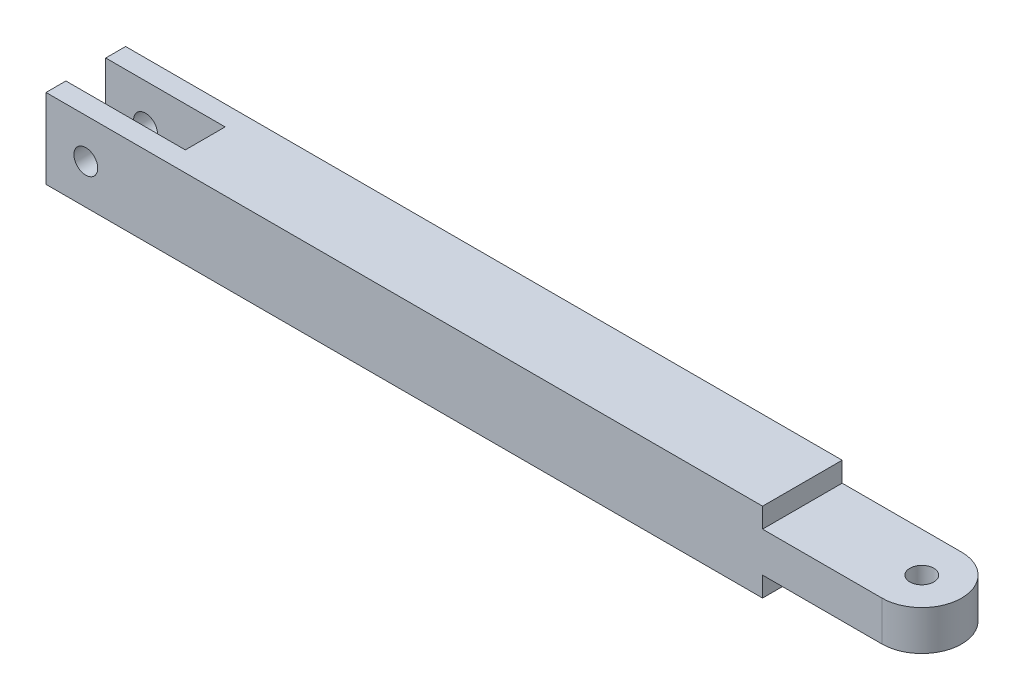
ISO-10303-21;
HEADER;
FILE_DESCRIPTION(('STEP AP214'),'2;1');
FILE_NAME('part.step','',(''),(''),'','','');
FILE_SCHEMA(('AUTOMOTIVE_DESIGN { 1 0 10303 214 1 1 1 1 }'));
ENDSEC;
DATA;
#1=APPLICATION_CONTEXT('core data for automotive mechanical design processes');
#2=APPLICATION_PROTOCOL_DEFINITION('international standard','automotive_design',2000,#1);
#3=PRODUCT_CONTEXT('',#1,'mechanical');
#4=PRODUCT('Part','Part','',(#3));
#5=PRODUCT_RELATED_PRODUCT_CATEGORY('part','',(#4));
#6=PRODUCT_DEFINITION_FORMATION('','',#4);
#7=PRODUCT_DEFINITION_CONTEXT('part definition',#1,'design');
#8=PRODUCT_DEFINITION('design','',#6,#7);
#9=PRODUCT_DEFINITION_SHAPE('','',#8);
#10=(LENGTH_UNIT() NAMED_UNIT(*) SI_UNIT(.MILLI.,.METRE.));
#11=(NAMED_UNIT(*) PLANE_ANGLE_UNIT() SI_UNIT($,.RADIAN.));
#12=(NAMED_UNIT(*) SI_UNIT($,.STERADIAN.) SOLID_ANGLE_UNIT());
#13=UNCERTAINTY_MEASURE_WITH_UNIT(LENGTH_MEASURE(1.E-05),#10,'distance_accuracy_value','');
#14=(GEOMETRIC_REPRESENTATION_CONTEXT(3) GLOBAL_UNCERTAINTY_ASSIGNED_CONTEXT((#13)) GLOBAL_UNIT_ASSIGNED_CONTEXT((#10,
#11,#12)) REPRESENTATION_CONTEXT('',''));
#15=CARTESIAN_POINT('',(0.,0.,0.));
#16=DIRECTION('',(0.,0.,1.));
#17=DIRECTION('',(1.,0.,0.));
#18=AXIS2_PLACEMENT_3D('',#15,#16,#17);
#19=CARTESIAN_POINT('',(0.,0.,0.));
#20=DIRECTION('',(0.,-1.,0.));
#21=DIRECTION('',(0.,0.,-1.));
#22=AXIS2_PLACEMENT_3D('',#19,#20,#21);
#23=PLANE('',#22);
#24=DIRECTION('',(-1.,0.,0.));
#25=VECTOR('',#24,1.);
#26=CARTESIAN_POINT('',(-50.,0.,-5.));
#27=LINE('',#26,#25);
#28=CARTESIAN_POINT('',(40.,0.,-5.));
#29=VERTEX_POINT('',#28);
#30=CARTESIAN_POINT('',(-50.,0.,-5.));
#31=VERTEX_POINT('',#30);
#32=EDGE_CURVE('E134',#29,#31,#27,.T.);
#33=ORIENTED_EDGE('',*,*,#32,.F.);
#34=DIRECTION('',(0.,0.,-1.));
#35=VECTOR('',#34,1.);
#36=CARTESIAN_POINT('',(40.,0.,5.));
#37=LINE('',#36,#35);
#38=CARTESIAN_POINT('',(40.,0.,5.));
#39=VERTEX_POINT('',#38);
#40=EDGE_CURVE('E194',#39,#29,#37,.T.);
#41=ORIENTED_EDGE('',*,*,#40,.F.);
#42=DIRECTION('',(1.,0.,0.));
#43=VECTOR('',#42,1.);
#44=CARTESIAN_POINT('',(-50.,0.,5.));
#45=LINE('',#44,#43);
#46=CARTESIAN_POINT('',(-50.,0.,5.));
#47=VERTEX_POINT('',#46);
#48=EDGE_CURVE('E145',#47,#39,#45,.T.);
#49=ORIENTED_EDGE('',*,*,#48,.F.);
#50=DIRECTION('',(0.,0.,1.));
#51=VECTOR('',#50,1.);
#52=CARTESIAN_POINT('',(-50.,0.,5.));
#53=LINE('',#52,#51);
#54=CARTESIAN_POINT('',(-50.,0.,2.5));
#55=VERTEX_POINT('',#54);
#56=EDGE_CURVE('E86',#55,#47,#53,.T.);
#57=ORIENTED_EDGE('',*,*,#56,.F.);
#58=DIRECTION('',(-1.,0.,0.));
#59=VECTOR('',#58,1.);
#60=CARTESIAN_POINT('',(-50.,0.,2.5));
#61=LINE('',#60,#59);
#62=CARTESIAN_POINT('',(-35.,0.,2.5));
#63=VERTEX_POINT('',#62);
#64=EDGE_CURVE('E142',#63,#55,#61,.T.);
#65=ORIENTED_EDGE('',*,*,#64,.F.);
#66=DIRECTION('',(0.,0.,1.));
#67=VECTOR('',#66,1.);
#68=CARTESIAN_POINT('',(-35.,0.,-2.5));
#69=LINE('',#68,#67);
#70=CARTESIAN_POINT('',(-35.,0.,-2.5));
#71=VERTEX_POINT('',#70);
#72=EDGE_CURVE('E120',#71,#63,#69,.T.);
#73=ORIENTED_EDGE('',*,*,#72,.F.);
#74=DIRECTION('',(1.,0.,0.));
#75=VECTOR('',#74,1.);
#76=CARTESIAN_POINT('',(-50.,0.,-2.5));
#77=LINE('',#76,#75);
#78=CARTESIAN_POINT('',(-50.,0.,-2.5));
#79=VERTEX_POINT('',#78);
#80=EDGE_CURVE('E139',#79,#71,#77,.T.);
#81=ORIENTED_EDGE('',*,*,#80,.F.);
#82=DIRECTION('',(0.,0.,1.));
#83=VECTOR('',#82,1.);
#84=CARTESIAN_POINT('',(-50.,0.,-2.5));
#85=LINE('',#84,#83);
#86=EDGE_CURVE('E136',#31,#79,#85,.T.);
#87=ORIENTED_EDGE('',*,*,#86,.F.);
#88=EDGE_LOOP('',(#33,#41,#49,#57,#65,#73,#81,#87));
#89=FACE_BOUND('',#88,.T.);
#90=ADVANCED_FACE('F33',(#89),#23,.T.);
#91=CARTESIAN_POINT('',(0.,10.,0.));
#92=DIRECTION('',(0.,-1.,0.));
#93=DIRECTION('',(0.,0.,-1.));
#94=AXIS2_PLACEMENT_3D('',#91,#92,#93);
#95=PLANE('',#94);
#96=DIRECTION('',(0.,0.,1.));
#97=VECTOR('',#96,1.);
#98=CARTESIAN_POINT('',(40.,10.,-5.));
#99=LINE('',#98,#97);
#100=CARTESIAN_POINT('',(40.,10.,-5.));
#101=VERTEX_POINT('',#100);
#102=CARTESIAN_POINT('',(40.,10.,5.));
#103=VERTEX_POINT('',#102);
#104=EDGE_CURVE('E208',#101,#103,#99,.T.);
#105=ORIENTED_EDGE('',*,*,#104,.F.);
#106=DIRECTION('',(-1.,0.,0.));
#107=VECTOR('',#106,1.);
#108=CARTESIAN_POINT('',(-50.,10.,-5.));
#109=LINE('',#108,#107);
#110=CARTESIAN_POINT('',(-50.,10.,-5.));
#111=VERTEX_POINT('',#110);
#112=EDGE_CURVE('E94',#101,#111,#109,.T.);
#113=ORIENTED_EDGE('',*,*,#112,.T.);
#114=DIRECTION('',(0.,0.,1.));
#115=VECTOR('',#114,1.);
#116=CARTESIAN_POINT('',(-50.,10.,-2.5));
#117=LINE('',#116,#115);
#118=CARTESIAN_POINT('',(-50.,10.,-2.5));
#119=VERTEX_POINT('',#118);
#120=EDGE_CURVE('E234',#111,#119,#117,.T.);
#121=ORIENTED_EDGE('',*,*,#120,.T.);
#122=DIRECTION('',(1.,0.,0.));
#123=VECTOR('',#122,1.);
#124=CARTESIAN_POINT('',(-50.,10.,-2.5));
#125=LINE('',#124,#123);
#126=CARTESIAN_POINT('',(-35.,10.,-2.5));
#127=VERTEX_POINT('',#126);
#128=EDGE_CURVE('E111',#119,#127,#125,.T.);
#129=ORIENTED_EDGE('',*,*,#128,.T.);
#130=DIRECTION('',(0.,0.,1.));
#131=VECTOR('',#130,1.);
#132=CARTESIAN_POINT('',(-35.,10.,-2.5));
#133=LINE('',#132,#131);
#134=CARTESIAN_POINT('',(-35.,10.,2.5));
#135=VERTEX_POINT('',#134);
#136=EDGE_CURVE('E104',#127,#135,#133,.T.);
#137=ORIENTED_EDGE('',*,*,#136,.T.);
#138=DIRECTION('',(-1.,0.,0.));
#139=VECTOR('',#138,1.);
#140=CARTESIAN_POINT('',(-50.,10.,2.5));
#141=LINE('',#140,#139);
#142=CARTESIAN_POINT('',(-50.,10.,2.5));
#143=VERTEX_POINT('',#142);
#144=EDGE_CURVE('E108',#135,#143,#141,.T.);
#145=ORIENTED_EDGE('',*,*,#144,.T.);
#146=DIRECTION('',(0.,0.,1.));
#147=VECTOR('',#146,1.);
#148=CARTESIAN_POINT('',(-50.,10.,5.));
#149=LINE('',#148,#147);
#150=CARTESIAN_POINT('',(-50.,10.,5.));
#151=VERTEX_POINT('',#150);
#152=EDGE_CURVE('E59',#143,#151,#149,.T.);
#153=ORIENTED_EDGE('',*,*,#152,.T.);
#154=DIRECTION('',(1.,0.,0.));
#155=VECTOR('',#154,1.);
#156=CARTESIAN_POINT('',(-50.,10.,5.));
#157=LINE('',#156,#155);
#158=EDGE_CURVE('E128',#151,#103,#157,.T.);
#159=ORIENTED_EDGE('',*,*,#158,.T.);
#160=EDGE_LOOP('',(#105,#113,#121,#129,#137,#145,#153,#159));
#161=FACE_BOUND('',#160,.T.);
#162=ADVANCED_FACE('F106',(#161),#95,.F.);
#163=CARTESIAN_POINT('',(-50.,10.,-5.));
#164=DIRECTION('',(0.,0.,1.));
#165=DIRECTION('',(1.,0.,0.));
#166=AXIS2_PLACEMENT_3D('',#163,#164,#165);
#167=PLANE('',#166);
#168=CARTESIAN_POINT('',(-45.,5.,-5.));
#169=DIRECTION('',(0.,0.,1.));
#170=DIRECTION('',(1.,0.,0.));
#171=AXIS2_PLACEMENT_3D('',#168,#169,#170);
#172=CIRCLE('',#171,1.5);
#173=CARTESIAN_POINT('',(-43.5,5.,-5.));
#174=VERTEX_POINT('',#173);
#175=EDGE_CURVE('E217',#174,#174,#172,.T.);
#176=ORIENTED_EDGE('',*,*,#175,.T.);
#177=EDGE_LOOP('',(#176));
#178=FACE_BOUND('',#177,.T.);
#179=DIRECTION('',(-1.,0.,0.));
#180=VECTOR('',#179,1.);
#181=CARTESIAN_POINT('',(60.,2.5,-5.));
#182=LINE('',#181,#180);
#183=CARTESIAN_POINT('',(55.,2.5,-4.99999999999999));
#184=VERTEX_POINT('',#183);
#185=CARTESIAN_POINT('',(40.,2.5,-5.));
#186=VERTEX_POINT('',#185);
#187=EDGE_CURVE('E158',#184,#186,#182,.T.);
#188=ORIENTED_EDGE('',*,*,#187,.T.);
#189=DIRECTION('',(0.,1.,0.));
#190=VECTOR('',#189,1.);
#191=CARTESIAN_POINT('',(40.,0.,-5.));
#192=LINE('',#191,#190);
#193=EDGE_CURVE('E190',#29,#186,#192,.T.);
#194=ORIENTED_EDGE('',*,*,#193,.F.);
#195=ORIENTED_EDGE('',*,*,#32,.T.);
#196=DIRECTION('',(0.,-1.,0.));
#197=VECTOR('',#196,1.);
#198=CARTESIAN_POINT('',(-50.,10.,-5.));
#199=LINE('',#198,#197);
#200=EDGE_CURVE('E11',#111,#31,#199,.T.);
#201=ORIENTED_EDGE('',*,*,#200,.F.);
#202=ORIENTED_EDGE('',*,*,#112,.F.);
#203=DIRECTION('',(0.,1.,0.));
#204=VECTOR('',#203,1.);
#205=CARTESIAN_POINT('',(40.,7.5,-5.));
#206=LINE('',#205,#204);
#207=CARTESIAN_POINT('',(40.,7.5,-5.));
#208=VERTEX_POINT('',#207);
#209=EDGE_CURVE('E205',#208,#101,#206,.T.);
#210=ORIENTED_EDGE('',*,*,#209,.F.);
#211=DIRECTION('',(-1.,0.,0.));
#212=VECTOR('',#211,1.);
#213=CARTESIAN_POINT('',(60.,7.5,-5.));
#214=LINE('',#213,#212);
#215=CARTESIAN_POINT('',(55.,7.5,-5.));
#216=VERTEX_POINT('',#215);
#217=EDGE_CURVE('E161',#216,#208,#214,.T.);
#218=ORIENTED_EDGE('',*,*,#217,.F.);
#219=DIRECTION('',(0.,1.,0.));
#220=VECTOR('',#219,1.);
#221=CARTESIAN_POINT('',(55.,-2.5,-4.99999999999999));
#222=LINE('',#221,#220);
#223=EDGE_CURVE('E50',#184,#216,#222,.T.);
#224=ORIENTED_EDGE('',*,*,#223,.F.);
#225=EDGE_LOOP('',(#188,#194,#195,#201,#202,#210,#218,#224));
#226=FACE_BOUND('',#225,.T.);
#227=ADVANCED_FACE('F35',(#178,#226),#167,.F.);
#228=CARTESIAN_POINT('',(-50.,10.,-2.5));
#229=DIRECTION('',(1.,0.,0.));
#230=DIRECTION('',(0.,0.,-1.));
#231=AXIS2_PLACEMENT_3D('',#228,#229,#230);
#232=PLANE('',#231);
#233=ORIENTED_EDGE('',*,*,#86,.T.);
#234=DIRECTION('',(0.,-1.,0.));
#235=VECTOR('',#234,1.);
#236=CARTESIAN_POINT('',(-50.,10.,-2.5));
#237=LINE('',#236,#235);
#238=EDGE_CURVE('E42',#119,#79,#237,.T.);
#239=ORIENTED_EDGE('',*,*,#238,.F.);
#240=ORIENTED_EDGE('',*,*,#120,.F.);
#241=ORIENTED_EDGE('',*,*,#200,.T.);
#242=EDGE_LOOP('',(#233,#239,#240,#241));
#243=FACE_BOUND('',#242,.T.);
#244=ADVANCED_FACE('F238',(#243),#232,.F.);
#245=CARTESIAN_POINT('',(-50.,10.,-2.5));
#246=DIRECTION('',(0.,0.,-1.));
#247=DIRECTION('',(-1.,0.,0.));
#248=AXIS2_PLACEMENT_3D('',#245,#246,#247);
#249=PLANE('',#248);
#250=CARTESIAN_POINT('',(-45.,5.,-2.5));
#251=DIRECTION('',(0.,0.,-1.));
#252=DIRECTION('',(-1.,0.,0.));
#253=AXIS2_PLACEMENT_3D('',#250,#251,#252);
#254=CIRCLE('',#253,1.5);
#255=CARTESIAN_POINT('',(-46.5,5.,-2.5));
#256=VERTEX_POINT('',#255);
#257=EDGE_CURVE('E214',#256,#256,#254,.T.);
#258=ORIENTED_EDGE('',*,*,#257,.T.);
#259=EDGE_LOOP('',(#258));
#260=FACE_BOUND('',#259,.T.);
#261=ORIENTED_EDGE('',*,*,#80,.T.);
#262=DIRECTION('',(0.,-1.,0.));
#263=VECTOR('',#262,1.);
#264=CARTESIAN_POINT('',(-35.,10.,-2.5));
#265=LINE('',#264,#263);
#266=EDGE_CURVE('E123',#127,#71,#265,.T.);
#267=ORIENTED_EDGE('',*,*,#266,.F.);
#268=ORIENTED_EDGE('',*,*,#128,.F.);
#269=ORIENTED_EDGE('',*,*,#238,.T.);
#270=EDGE_LOOP('',(#261,#267,#268,#269));
#271=FACE_BOUND('',#270,.T.);
#272=ADVANCED_FACE('F242',(#260,#271),#249,.F.);
#273=CARTESIAN_POINT('',(-35.,10.,-2.5));
#274=DIRECTION('',(1.,0.,0.));
#275=DIRECTION('',(0.,0.,-1.));
#276=AXIS2_PLACEMENT_3D('',#273,#274,#275);
#277=PLANE('',#276);
#278=ORIENTED_EDGE('',*,*,#72,.T.);
#279=DIRECTION('',(0.,-1.,0.));
#280=VECTOR('',#279,1.);
#281=CARTESIAN_POINT('',(-35.,10.,2.5));
#282=LINE('',#281,#280);
#283=EDGE_CURVE('E117',#135,#63,#282,.T.);
#284=ORIENTED_EDGE('',*,*,#283,.F.);
#285=ORIENTED_EDGE('',*,*,#136,.F.);
#286=ORIENTED_EDGE('',*,*,#266,.T.);
#287=EDGE_LOOP('',(#278,#284,#285,#286));
#288=FACE_BOUND('',#287,.T.);
#289=ADVANCED_FACE('F118',(#288),#277,.F.);
#290=CARTESIAN_POINT('',(-50.,10.,2.5));
#291=DIRECTION('',(0.,0.,1.));
#292=DIRECTION('',(1.,0.,0.));
#293=AXIS2_PLACEMENT_3D('',#290,#291,#292);
#294=PLANE('',#293);
#295=CARTESIAN_POINT('',(-45.,5.,2.5));
#296=DIRECTION('',(0.,0.,1.));
#297=DIRECTION('',(1.,0.,0.));
#298=AXIS2_PLACEMENT_3D('',#295,#296,#297);
#299=CIRCLE('',#298,1.5);
#300=CARTESIAN_POINT('',(-43.5,5.,2.5));
#301=VERTEX_POINT('',#300);
#302=EDGE_CURVE('E211',#301,#301,#299,.T.);
#303=ORIENTED_EDGE('',*,*,#302,.T.);
#304=EDGE_LOOP('',(#303));
#305=FACE_BOUND('',#304,.T.);
#306=ORIENTED_EDGE('',*,*,#64,.T.);
#307=DIRECTION('',(0.,-1.,0.));
#308=VECTOR('',#307,1.);
#309=CARTESIAN_POINT('',(-50.,10.,2.5));
#310=LINE('',#309,#308);
#311=EDGE_CURVE('E124',#143,#55,#310,.T.);
#312=ORIENTED_EDGE('',*,*,#311,.F.);
#313=ORIENTED_EDGE('',*,*,#144,.F.);
#314=ORIENTED_EDGE('',*,*,#283,.T.);
#315=EDGE_LOOP('',(#306,#312,#313,#314));
#316=FACE_BOUND('',#315,.T.);
#317=ADVANCED_FACE('F126',(#305,#316),#294,.F.);
#318=CARTESIAN_POINT('',(-50.,10.,5.));
#319=DIRECTION('',(1.,0.,0.));
#320=DIRECTION('',(0.,0.,-1.));
#321=AXIS2_PLACEMENT_3D('',#318,#319,#320);
#322=PLANE('',#321);
#323=ORIENTED_EDGE('',*,*,#56,.T.);
#324=DIRECTION('',(0.,-1.,0.));
#325=VECTOR('',#324,1.);
#326=CARTESIAN_POINT('',(-50.,10.,5.));
#327=LINE('',#326,#325);
#328=EDGE_CURVE('E133',#151,#47,#327,.T.);
#329=ORIENTED_EDGE('',*,*,#328,.F.);
#330=ORIENTED_EDGE('',*,*,#152,.F.);
#331=ORIENTED_EDGE('',*,*,#311,.T.);
#332=EDGE_LOOP('',(#323,#329,#330,#331));
#333=FACE_BOUND('',#332,.T.);
#334=ADVANCED_FACE('F245',(#333),#322,.F.);
#335=CARTESIAN_POINT('',(-50.,10.,5.));
#336=DIRECTION('',(0.,0.,-1.));
#337=DIRECTION('',(-1.,0.,0.));
#338=AXIS2_PLACEMENT_3D('',#335,#336,#337);
#339=PLANE('',#338);
#340=CARTESIAN_POINT('',(-45.,5.,5.));
#341=DIRECTION('',(0.,0.,-1.));
#342=DIRECTION('',(-1.,0.,0.));
#343=AXIS2_PLACEMENT_3D('',#340,#341,#342);
#344=CIRCLE('',#343,1.5);
#345=CARTESIAN_POINT('',(-46.5,5.,5.));
#346=VERTEX_POINT('',#345);
#347=EDGE_CURVE('E37',#346,#346,#344,.T.);
#348=ORIENTED_EDGE('',*,*,#347,.T.);
#349=EDGE_LOOP('',(#348));
#350=FACE_BOUND('',#349,.T.);
#351=DIRECTION('',(0.,-1.,0.));
#352=VECTOR('',#351,1.);
#353=CARTESIAN_POINT('',(40.,2.5,5.));
#354=LINE('',#353,#352);
#355=CARTESIAN_POINT('',(40.,2.5,5.));
#356=VERTEX_POINT('',#355);
#357=EDGE_CURVE('E187',#356,#39,#354,.T.);
#358=ORIENTED_EDGE('',*,*,#357,.F.);
#359=DIRECTION('',(-1.,0.,0.));
#360=VECTOR('',#359,1.);
#361=CARTESIAN_POINT('',(60.,2.5,4.99999999999999));
#362=LINE('',#361,#360);
#363=CARTESIAN_POINT('',(55.,2.5,4.99999999999999));
#364=VERTEX_POINT('',#363);
#365=EDGE_CURVE('E137',#364,#356,#362,.T.);
#366=ORIENTED_EDGE('',*,*,#365,.F.);
#367=DIRECTION('',(0.,1.,0.));
#368=VECTOR('',#367,1.);
#369=CARTESIAN_POINT('',(55.,-2.5,4.99999999999999));
#370=LINE('',#369,#368);
#371=CARTESIAN_POINT('',(55.,7.5,4.99999999999999));
#372=VERTEX_POINT('',#371);
#373=EDGE_CURVE('E222',#364,#372,#370,.T.);
#374=ORIENTED_EDGE('',*,*,#373,.T.);
#375=DIRECTION('',(-1.,0.,0.));
#376=VECTOR('',#375,1.);
#377=CARTESIAN_POINT('',(60.,7.5,4.99999999999999));
#378=LINE('',#377,#376);
#379=CARTESIAN_POINT('',(40.,7.5,5.));
#380=VERTEX_POINT('',#379);
#381=EDGE_CURVE('E232',#372,#380,#378,.T.);
#382=ORIENTED_EDGE('',*,*,#381,.T.);
#383=DIRECTION('',(0.,-1.,0.));
#384=VECTOR('',#383,1.);
#385=CARTESIAN_POINT('',(40.,10.,5.));
#386=LINE('',#385,#384);
#387=EDGE_CURVE('E196',#103,#380,#386,.T.);
#388=ORIENTED_EDGE('',*,*,#387,.F.);
#389=ORIENTED_EDGE('',*,*,#158,.F.);
#390=ORIENTED_EDGE('',*,*,#328,.T.);
#391=ORIENTED_EDGE('',*,*,#48,.T.);
#392=EDGE_LOOP('',(#358,#366,#374,#382,#388,#389,#390,#391));
#393=FACE_BOUND('',#392,.T.);
#394=ADVANCED_FACE('F192',(#350,#393),#339,.F.);
#395=CARTESIAN_POINT('',(60.,2.5,4.99999999999999));
#396=DIRECTION('',(0.,1.,0.));
#397=DIRECTION('',(0.,0.,1.));
#398=AXIS2_PLACEMENT_3D('',#395,#396,#397);
#399=PLANE('',#398);
#400=CARTESIAN_POINT('',(55.,2.5,0.));
#401=DIRECTION('',(0.,1.,0.));
#402=DIRECTION('',(0.,0.,1.));
#403=AXIS2_PLACEMENT_3D('',#400,#401,#402);
#404=CIRCLE('',#403,1.5);
#405=CARTESIAN_POINT('',(55.,2.5,1.5));
#406=VERTEX_POINT('',#405);
#407=EDGE_CURVE('E229',#406,#406,#404,.T.);
#408=ORIENTED_EDGE('',*,*,#407,.T.);
#409=EDGE_LOOP('',(#408));
#410=FACE_BOUND('',#409,.T.);
#411=ORIENTED_EDGE('',*,*,#187,.F.);
#412=CARTESIAN_POINT('',(55.,2.5,0.));
#413=DIRECTION('',(0.,1.,0.));
#414=DIRECTION('',(0.,0.,1.));
#415=AXIS2_PLACEMENT_3D('',#412,#413,#414);
#416=CIRCLE('',#415,4.99999999999999);
#417=EDGE_CURVE('E176',#184,#364,#416,.F.);
#418=ORIENTED_EDGE('',*,*,#417,.T.);
#419=ORIENTED_EDGE('',*,*,#365,.T.);
#420=DIRECTION('',(0.,0.,1.));
#421=VECTOR('',#420,1.);
#422=CARTESIAN_POINT('',(40.,2.5,-5.));
#423=LINE('',#422,#421);
#424=EDGE_CURVE('E174',#186,#356,#423,.T.);
#425=ORIENTED_EDGE('',*,*,#424,.F.);
#426=EDGE_LOOP('',(#411,#418,#419,#425));
#427=FACE_BOUND('',#426,.T.);
#428=ADVANCED_FACE('F172',(#410,#427),#399,.F.);
#429=CARTESIAN_POINT('',(60.,7.5,4.99999999999999));
#430=DIRECTION('',(0.,-1.,0.));
#431=DIRECTION('',(0.,0.,-1.));
#432=AXIS2_PLACEMENT_3D('',#429,#430,#431);
#433=PLANE('',#432);
#434=CARTESIAN_POINT('',(55.,7.5,0.));
#435=DIRECTION('',(0.,1.,0.));
#436=DIRECTION('',(0.,0.,1.));
#437=AXIS2_PLACEMENT_3D('',#434,#435,#436);
#438=CIRCLE('',#437,1.5);
#439=CARTESIAN_POINT('',(55.,7.5,1.5));
#440=VERTEX_POINT('',#439);
#441=EDGE_CURVE('E226',#440,#440,#438,.T.);
#442=ORIENTED_EDGE('',*,*,#441,.F.);
#443=EDGE_LOOP('',(#442));
#444=FACE_BOUND('',#443,.T.);
#445=ORIENTED_EDGE('',*,*,#381,.F.);
#446=CARTESIAN_POINT('',(55.,7.5,0.));
#447=DIRECTION('',(0.,-1.,0.));
#448=DIRECTION('',(0.,0.,1.));
#449=AXIS2_PLACEMENT_3D('',#446,#447,#448);
#450=CIRCLE('',#449,4.99999999999999);
#451=EDGE_CURVE('E220',#216,#372,#450,.T.);
#452=ORIENTED_EDGE('',*,*,#451,.F.);
#453=ORIENTED_EDGE('',*,*,#217,.T.);
#454=DIRECTION('',(0.,0.,-1.));
#455=VECTOR('',#454,1.);
#456=CARTESIAN_POINT('',(40.,7.5,5.));
#457=LINE('',#456,#455);
#458=EDGE_CURVE('E202',#380,#208,#457,.T.);
#459=ORIENTED_EDGE('',*,*,#458,.F.);
#460=EDGE_LOOP('',(#445,#452,#453,#459));
#461=FACE_BOUND('',#460,.T.);
#462=ADVANCED_FACE('F272',(#444,#461),#433,.F.);
#463=CARTESIAN_POINT('',(55.,-2.5,0.));
#464=DIRECTION('',(0.,1.,0.));
#465=DIRECTION('',(0.,0.,1.));
#466=AXIS2_PLACEMENT_3D('',#463,#464,#465);
#467=CYLINDRICAL_SURFACE('',#466,1.5);
#468=ORIENTED_EDGE('',*,*,#441,.T.);
#469=EDGE_LOOP('',(#468));
#470=FACE_BOUND('',#469,.T.);
#471=ORIENTED_EDGE('',*,*,#407,.F.);
#472=EDGE_LOOP('',(#471));
#473=FACE_BOUND('',#472,.T.);
#474=ADVANCED_FACE('F362',(#470,#473),#467,.F.);
#475=CARTESIAN_POINT('',(55.,-2.5,0.));
#476=DIRECTION('',(0.,1.,0.));
#477=DIRECTION('',(0.,0.,1.));
#478=AXIS2_PLACEMENT_3D('',#475,#476,#477);
#479=CYLINDRICAL_SURFACE('',#478,4.99999999999999);
#480=ORIENTED_EDGE('',*,*,#223,.T.);
#481=ORIENTED_EDGE('',*,*,#451,.T.);
#482=ORIENTED_EDGE('',*,*,#373,.F.);
#483=ORIENTED_EDGE('',*,*,#417,.F.);
#484=EDGE_LOOP('',(#480,#481,#482,#483));
#485=FACE_BOUND('',#484,.T.);
#486=ADVANCED_FACE('F259',(#485),#479,.T.);
#487=CARTESIAN_POINT('',(-45.,5.,12.));
#488=DIRECTION('',(0.,0.,-1.));
#489=DIRECTION('',(-1.,0.,0.));
#490=AXIS2_PLACEMENT_3D('',#487,#488,#489);
#491=CYLINDRICAL_SURFACE('',#490,1.5);
#492=ORIENTED_EDGE('',*,*,#347,.F.);
#493=EDGE_LOOP('',(#492));
#494=FACE_BOUND('',#493,.T.);
#495=ORIENTED_EDGE('',*,*,#302,.F.);
#496=EDGE_LOOP('',(#495));
#497=FACE_BOUND('',#496,.T.);
#498=ADVANCED_FACE('F282',(#494,#497),#491,.F.);
#499=ORIENTED_EDGE('',*,*,#257,.F.);
#500=EDGE_LOOP('',(#499));
#501=FACE_BOUND('',#500,.T.);
#502=ORIENTED_EDGE('',*,*,#175,.F.);
#503=EDGE_LOOP('',(#502));
#504=FACE_BOUND('',#503,.T.);
#505=ADVANCED_FACE('F275',(#501,#504),#491,.F.);
#506=CARTESIAN_POINT('',(40.,0.,0.));
#507=DIRECTION('',(1.,0.,0.));
#508=DIRECTION('',(0.,0.,-1.));
#509=AXIS2_PLACEMENT_3D('',#506,#507,#508);
#510=PLANE('',#509);
#511=ORIENTED_EDGE('',*,*,#387,.T.);
#512=ORIENTED_EDGE('',*,*,#458,.T.);
#513=ORIENTED_EDGE('',*,*,#209,.T.);
#514=ORIENTED_EDGE('',*,*,#104,.T.);
#515=EDGE_LOOP('',(#511,#512,#513,#514));
#516=FACE_BOUND('',#515,.T.);
#517=ADVANCED_FACE('F273',(#516),#510,.T.);
#518=CARTESIAN_POINT('',(40.,0.,0.));
#519=DIRECTION('',(1.,0.,0.));
#520=DIRECTION('',(0.,0.,-1.));
#521=AXIS2_PLACEMENT_3D('',#518,#519,#520);
#522=PLANE('',#521);
#523=ORIENTED_EDGE('',*,*,#193,.T.);
#524=ORIENTED_EDGE('',*,*,#424,.T.);
#525=ORIENTED_EDGE('',*,*,#357,.T.);
#526=ORIENTED_EDGE('',*,*,#40,.T.);
#527=EDGE_LOOP('',(#523,#524,#525,#526));
#528=FACE_BOUND('',#527,.T.);
#529=ADVANCED_FACE('F185',(#528),#522,.T.);
#530=CLOSED_SHELL('',(#90,#162,#227,#244,#272,#289,#317,#334,#394,#428,#462,#474,#486,#498,#505,
#517,#529));
#531=MANIFOLD_SOLID_BREP('B2',#530);
#532=ADVANCED_BREP_SHAPE_REPRESENTATION('',(#18,#531),#14);
#533=SHAPE_DEFINITION_REPRESENTATION(#9,#532);
ENDSEC;
END-ISO-10303-21;
